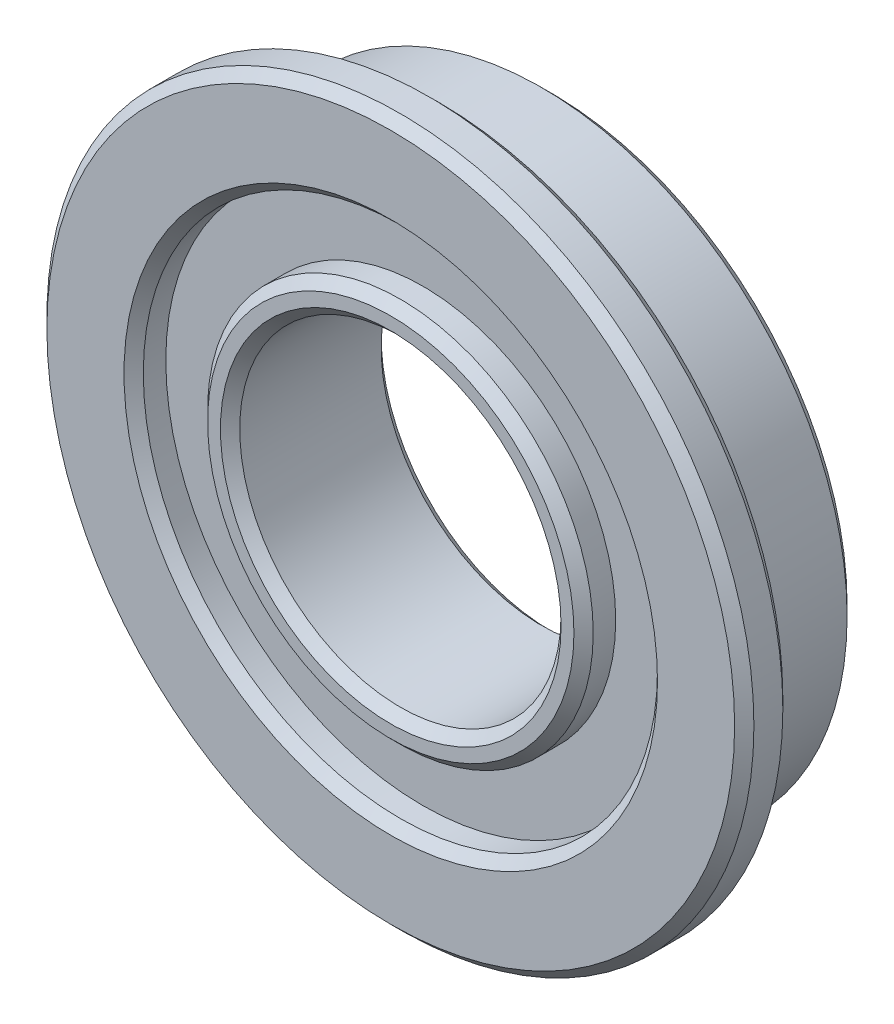
ISO-10303-21;
HEADER;
FILE_DESCRIPTION(('STEP AP214'),'2;1');
FILE_NAME('part.step','',(''),(''),'','','');
FILE_SCHEMA(('AUTOMOTIVE_DESIGN { 1 0 10303 214 1 1 1 1 }'));
ENDSEC;
DATA;
#1=APPLICATION_CONTEXT('core data for automotive mechanical design processes');
#2=APPLICATION_PROTOCOL_DEFINITION('international standard','automotive_design',2000,#1);
#3=PRODUCT_CONTEXT('',#1,'mechanical');
#4=PRODUCT('Part','Part','',(#3));
#5=PRODUCT_RELATED_PRODUCT_CATEGORY('part','',(#4));
#6=PRODUCT_DEFINITION_FORMATION('','',#4);
#7=PRODUCT_DEFINITION_CONTEXT('part definition',#1,'design');
#8=PRODUCT_DEFINITION('design','',#6,#7);
#9=PRODUCT_DEFINITION_SHAPE('','',#8);
#10=(LENGTH_UNIT() NAMED_UNIT(*) SI_UNIT(.MILLI.,.METRE.));
#11=(NAMED_UNIT(*) PLANE_ANGLE_UNIT() SI_UNIT($,.RADIAN.));
#12=(NAMED_UNIT(*) SI_UNIT($,.STERADIAN.) SOLID_ANGLE_UNIT());
#13=UNCERTAINTY_MEASURE_WITH_UNIT(LENGTH_MEASURE(1.E-05),#10,'distance_accuracy_value','');
#14=(GEOMETRIC_REPRESENTATION_CONTEXT(3) GLOBAL_UNCERTAINTY_ASSIGNED_CONTEXT((#13)) GLOBAL_UNIT_ASSIGNED_CONTEXT((#10,
#11,#12)) REPRESENTATION_CONTEXT('',''));
#15=CARTESIAN_POINT('',(0.,0.,0.));
#16=DIRECTION('',(0.,0.,1.));
#17=DIRECTION('',(1.,0.,0.));
#18=AXIS2_PLACEMENT_3D('',#15,#16,#17);
#19=CARTESIAN_POINT('',(0.,0.,5.));
#20=DIRECTION('',(0.,0.,1.));
#21=DIRECTION('',(1.,0.,0.));
#22=AXIS2_PLACEMENT_3D('',#19,#20,#21);
#23=PLANE('',#22);
#24=CARTESIAN_POINT('',(0.,0.,5.));
#25=DIRECTION('',(0.,0.,1.));
#26=DIRECTION('',(1.,0.,0.));
#27=AXIS2_PLACEMENT_3D('',#24,#25,#26);
#28=CIRCLE('',#27,5.7);
#29=CARTESIAN_POINT('',(5.7,0.,5.));
#30=VERTEX_POINT('',#29);
#31=EDGE_CURVE('E95',#30,#30,#28,.T.);
#32=ORIENTED_EDGE('',*,*,#31,.T.);
#33=EDGE_LOOP('',(#32));
#34=FACE_BOUND('',#33,.T.);
#35=CARTESIAN_POINT('',(0.,0.,5.));
#36=DIRECTION('',(0.,0.,1.));
#37=DIRECTION('',(1.,0.,0.));
#38=AXIS2_PLACEMENT_3D('',#35,#36,#37);
#39=CIRCLE('',#38,5.29999999999999);
#40=CARTESIAN_POINT('',(5.29999999999999,0.,5.));
#41=VERTEX_POINT('',#40);
#42=EDGE_CURVE('E98',#41,#41,#39,.F.);
#43=ORIENTED_EDGE('',*,*,#42,.T.);
#44=EDGE_LOOP('',(#43));
#45=FACE_BOUND('',#44,.T.);
#46=ADVANCED_FACE('F38',(#34,#45),#23,.T.);
#47=CARTESIAN_POINT('',(0.,0.,0.));
#48=DIRECTION('',(0.,0.,1.));
#49=DIRECTION('',(1.,0.,0.));
#50=AXIS2_PLACEMENT_3D('',#47,#48,#49);
#51=PLANE('',#50);
#52=CARTESIAN_POINT('',(0.,0.,0.));
#53=DIRECTION('',(0.,0.,1.));
#54=DIRECTION('',(1.,0.,0.));
#55=AXIS2_PLACEMENT_3D('',#52,#53,#54);
#56=CIRCLE('',#55,5.7);
#57=CARTESIAN_POINT('',(5.7,0.,0.));
#58=VERTEX_POINT('',#57);
#59=EDGE_CURVE('E46',#58,#58,#56,.F.);
#60=ORIENTED_EDGE('',*,*,#59,.T.);
#61=EDGE_LOOP('',(#60));
#62=FACE_BOUND('',#61,.T.);
#63=CARTESIAN_POINT('',(0.,0.,0.));
#64=DIRECTION('',(0.,0.,1.));
#65=DIRECTION('',(1.,0.,0.));
#66=AXIS2_PLACEMENT_3D('',#63,#64,#65);
#67=CIRCLE('',#66,5.3);
#68=CARTESIAN_POINT('',(5.3,0.,0.));
#69=VERTEX_POINT('',#68);
#70=EDGE_CURVE('E50',#69,#69,#67,.T.);
#71=ORIENTED_EDGE('',*,*,#70,.T.);
#72=EDGE_LOOP('',(#71));
#73=FACE_BOUND('',#72,.T.);
#74=ADVANCED_FACE('F136',(#62,#73),#51,.F.);
#75=CARTESIAN_POINT('',(0.,0.,5.));
#76=DIRECTION('',(0.,0.,-1.));
#77=DIRECTION('',(-1.,0.,0.));
#78=AXIS2_PLACEMENT_3D('',#75,#76,#77);
#79=CYLINDRICAL_SURFACE('',#78,9.5);
#80=CARTESIAN_POINT('',(0.,0.,0.299999999999998));
#81=DIRECTION('',(0.,0.,1.));
#82=DIRECTION('',(1.,0.,0.));
#83=AXIS2_PLACEMENT_3D('',#80,#81,#82);
#84=CIRCLE('',#83,9.5);
#85=CARTESIAN_POINT('',(9.5,0.,0.299999999999998));
#86=VERTEX_POINT('',#85);
#87=EDGE_CURVE('E65',#86,#86,#84,.T.);
#88=ORIENTED_EDGE('',*,*,#87,.T.);
#89=EDGE_LOOP('',(#88));
#90=FACE_BOUND('',#89,.T.);
#91=CARTESIAN_POINT('',(0.,0.,3.5));
#92=DIRECTION('',(0.,0.,1.));
#93=DIRECTION('',(1.,0.,0.));
#94=AXIS2_PLACEMENT_3D('',#91,#92,#93);
#95=CIRCLE('',#94,9.5);
#96=CARTESIAN_POINT('',(9.5,0.,3.5));
#97=VERTEX_POINT('',#96);
#98=EDGE_CURVE('E101',#97,#97,#95,.T.);
#99=ORIENTED_EDGE('',*,*,#98,.F.);
#100=EDGE_LOOP('',(#99));
#101=FACE_BOUND('',#100,.T.);
#102=ADVANCED_FACE('F143',(#90,#101),#79,.T.);
#103=CARTESIAN_POINT('',(0.,0.,5.));
#104=DIRECTION('',(0.,0.,1.));
#105=DIRECTION('',(1.,0.,0.));
#106=AXIS2_PLACEMENT_3D('',#103,#104,#105);
#107=CIRCLE('',#106,8.3);
#108=CARTESIAN_POINT('',(8.3,0.,5.));
#109=VERTEX_POINT('',#108);
#110=EDGE_CURVE('E77',#109,#109,#107,.F.);
#111=ORIENTED_EDGE('',*,*,#110,.T.);
#112=EDGE_LOOP('',(#111));
#113=FACE_BOUND('',#112,.T.);
#114=CARTESIAN_POINT('',(0.,0.,5.));
#115=DIRECTION('',(0.,0.,1.));
#116=DIRECTION('',(1.,0.,0.));
#117=AXIS2_PLACEMENT_3D('',#114,#115,#116);
#118=CIRCLE('',#117,10.7);
#119=CARTESIAN_POINT('',(10.7,0.,5.));
#120=VERTEX_POINT('',#119);
#121=EDGE_CURVE('E80',#120,#120,#118,.T.);
#122=ORIENTED_EDGE('',*,*,#121,.T.);
#123=EDGE_LOOP('',(#122));
#124=FACE_BOUND('',#123,.T.);
#125=ADVANCED_FACE('F139',(#113,#124),#23,.T.);
#126=CARTESIAN_POINT('',(0.,0.,0.));
#127=DIRECTION('',(0.,0.,1.));
#128=DIRECTION('',(1.,0.,0.));
#129=AXIS2_PLACEMENT_3D('',#126,#127,#128);
#130=CIRCLE('',#129,9.2);
#131=CARTESIAN_POINT('',(9.2,0.,0.));
#132=VERTEX_POINT('',#131);
#133=EDGE_CURVE('E59',#132,#132,#130,.F.);
#134=ORIENTED_EDGE('',*,*,#133,.T.);
#135=EDGE_LOOP('',(#134));
#136=FACE_BOUND('',#135,.T.);
#137=CARTESIAN_POINT('',(0.,0.,0.));
#138=DIRECTION('',(0.,0.,1.));
#139=DIRECTION('',(1.,0.,0.));
#140=AXIS2_PLACEMENT_3D('',#137,#138,#139);
#141=CIRCLE('',#140,8.30000000000001);
#142=CARTESIAN_POINT('',(-8.30000000000001,0.,0.));
#143=VERTEX_POINT('',#142);
#144=EDGE_CURVE('E62',#143,#143,#141,.T.);
#145=ORIENTED_EDGE('',*,*,#144,.T.);
#146=EDGE_LOOP('',(#145));
#147=FACE_BOUND('',#146,.T.);
#148=ADVANCED_FACE('F145',(#136,#147),#51,.F.);
#149=CARTESIAN_POINT('',(0.,0.,5.));
#150=DIRECTION('',(0.,0.,-1.));
#151=DIRECTION('',(-1.,0.,0.));
#152=AXIS2_PLACEMENT_3D('',#149,#150,#151);
#153=CYLINDRICAL_SURFACE('',#152,5.);
#154=CARTESIAN_POINT('',(0.,0.,4.70000000000001));
#155=DIRECTION('',(0.,0.,1.));
#156=DIRECTION('',(1.,0.,0.));
#157=AXIS2_PLACEMENT_3D('',#154,#155,#156);
#158=CIRCLE('',#157,5.);
#159=CARTESIAN_POINT('',(5.,0.,4.70000000000001));
#160=VERTEX_POINT('',#159);
#161=EDGE_CURVE('E86',#160,#160,#158,.T.);
#162=ORIENTED_EDGE('',*,*,#161,.T.);
#163=EDGE_LOOP('',(#162));
#164=FACE_BOUND('',#163,.T.);
#165=CARTESIAN_POINT('',(0.,0.,0.300000000000003));
#166=DIRECTION('',(0.,0.,1.));
#167=DIRECTION('',(1.,0.,0.));
#168=AXIS2_PLACEMENT_3D('',#165,#166,#167);
#169=CIRCLE('',#168,5.);
#170=CARTESIAN_POINT('',(5.,0.,0.300000000000003));
#171=VERTEX_POINT('',#170);
#172=EDGE_CURVE('E89',#171,#171,#169,.F.);
#173=ORIENTED_EDGE('',*,*,#172,.T.);
#174=EDGE_LOOP('',(#173));
#175=FACE_BOUND('',#174,.T.);
#176=ADVANCED_FACE('F154',(#164,#175),#153,.F.);
#177=CARTESIAN_POINT('',(0.,0.,3.5));
#178=DIRECTION('',(0.,0.,1.));
#179=DIRECTION('',(1.,0.,0.));
#180=AXIS2_PLACEMENT_3D('',#177,#178,#179);
#181=CYLINDRICAL_SURFACE('',#180,11.);
#182=CARTESIAN_POINT('',(0.,0.,4.7));
#183=DIRECTION('',(0.,0.,1.));
#184=DIRECTION('',(1.,0.,0.));
#185=AXIS2_PLACEMENT_3D('',#182,#183,#184);
#186=CIRCLE('',#185,11.);
#187=CARTESIAN_POINT('',(11.,0.,4.7));
#188=VERTEX_POINT('',#187);
#189=EDGE_CURVE('E71',#188,#188,#186,.F.);
#190=ORIENTED_EDGE('',*,*,#189,.T.);
#191=EDGE_LOOP('',(#190));
#192=FACE_BOUND('',#191,.T.);
#193=CARTESIAN_POINT('',(0.,0.,3.8));
#194=DIRECTION('',(0.,0.,1.));
#195=DIRECTION('',(1.,0.,0.));
#196=AXIS2_PLACEMENT_3D('',#193,#194,#195);
#197=CIRCLE('',#196,11.);
#198=CARTESIAN_POINT('',(11.,0.,3.8));
#199=VERTEX_POINT('',#198);
#200=EDGE_CURVE('E74',#199,#199,#197,.T.);
#201=ORIENTED_EDGE('',*,*,#200,.T.);
#202=EDGE_LOOP('',(#201));
#203=FACE_BOUND('',#202,.T.);
#204=ADVANCED_FACE('F219',(#192,#203),#181,.T.);
#205=CARTESIAN_POINT('',(0.,0.,3.5));
#206=DIRECTION('',(0.,0.,1.));
#207=DIRECTION('',(1.,0.,0.));
#208=AXIS2_PLACEMENT_3D('',#205,#206,#207);
#209=PLANE('',#208);
#210=CARTESIAN_POINT('',(0.,0.,3.5));
#211=DIRECTION('',(0.,0.,1.));
#212=DIRECTION('',(1.,0.,0.));
#213=AXIS2_PLACEMENT_3D('',#210,#211,#212);
#214=CIRCLE('',#213,10.7);
#215=CARTESIAN_POINT('',(10.7,0.,3.5));
#216=VERTEX_POINT('',#215);
#217=EDGE_CURVE('E68',#216,#216,#214,.F.);
#218=ORIENTED_EDGE('',*,*,#217,.T.);
#219=EDGE_LOOP('',(#218));
#220=FACE_BOUND('',#219,.T.);
#221=ORIENTED_EDGE('',*,*,#98,.T.);
#222=EDGE_LOOP('',(#221));
#223=FACE_BOUND('',#222,.T.);
#224=ADVANCED_FACE('F224',(#220,#223),#209,.F.);
#225=CARTESIAN_POINT('',(0.,0.,1.));
#226=DIRECTION('',(0.,0.,-1.));
#227=DIRECTION('',(-1.,0.,0.));
#228=AXIS2_PLACEMENT_3D('',#225,#226,#227);
#229=CYLINDRICAL_SURFACE('',#228,8.);
#230=CARTESIAN_POINT('',(0.,0.,0.300000000000005));
#231=DIRECTION('',(0.,0.,1.));
#232=DIRECTION('',(1.,0.,0.));
#233=AXIS2_PLACEMENT_3D('',#230,#231,#232);
#234=CIRCLE('',#233,8.);
#235=CARTESIAN_POINT('',(-8.,0.,0.300000000000005));
#236=VERTEX_POINT('',#235);
#237=EDGE_CURVE('E54',#236,#236,#234,.F.);
#238=ORIENTED_EDGE('',*,*,#237,.T.);
#239=EDGE_LOOP('',(#238));
#240=FACE_BOUND('',#239,.T.);
#241=CARTESIAN_POINT('',(0.,0.,1.));
#242=DIRECTION('',(0.,0.,-1.));
#243=DIRECTION('',(-1.,0.,0.));
#244=AXIS2_PLACEMENT_3D('',#241,#242,#243);
#245=CIRCLE('',#244,8.);
#246=CARTESIAN_POINT('',(-8.,0.,1.));
#247=VERTEX_POINT('',#246);
#248=EDGE_CURVE('E104',#247,#247,#245,.T.);
#249=ORIENTED_EDGE('',*,*,#248,.F.);
#250=EDGE_LOOP('',(#249));
#251=FACE_BOUND('',#250,.T.);
#252=ADVANCED_FACE('F230',(#240,#251),#229,.F.);
#253=CARTESIAN_POINT('',(0.,0.,1.));
#254=DIRECTION('',(0.,0.,-1.));
#255=DIRECTION('',(-1.,0.,0.));
#256=AXIS2_PLACEMENT_3D('',#253,#254,#255);
#257=PLANE('',#256);
#258=CARTESIAN_POINT('',(0.,0.,1.));
#259=DIRECTION('',(0.,0.,-1.));
#260=DIRECTION('',(-1.,0.,0.));
#261=AXIS2_PLACEMENT_3D('',#258,#259,#260);
#262=CIRCLE('',#261,6.);
#263=CARTESIAN_POINT('',(-6.,0.,1.));
#264=VERTEX_POINT('',#263);
#265=EDGE_CURVE('E107',#264,#264,#262,.T.);
#266=ORIENTED_EDGE('',*,*,#265,.F.);
#267=EDGE_LOOP('',(#266));
#268=FACE_BOUND('',#267,.T.);
#269=ORIENTED_EDGE('',*,*,#248,.T.);
#270=EDGE_LOOP('',(#269));
#271=FACE_BOUND('',#270,.T.);
#272=ADVANCED_FACE('F133',(#268,#271),#257,.T.);
#273=CARTESIAN_POINT('',(0.,0.,1.));
#274=DIRECTION('',(0.,0.,-1.));
#275=DIRECTION('',(-1.,0.,0.));
#276=AXIS2_PLACEMENT_3D('',#273,#274,#275);
#277=CYLINDRICAL_SURFACE('',#276,6.);
#278=CARTESIAN_POINT('',(0.,0.,0.299999999999997));
#279=DIRECTION('',(0.,0.,1.));
#280=DIRECTION('',(1.,0.,0.));
#281=AXIS2_PLACEMENT_3D('',#278,#279,#280);
#282=CIRCLE('',#281,6.);
#283=CARTESIAN_POINT('',(6.,0.,0.299999999999997));
#284=VERTEX_POINT('',#283);
#285=EDGE_CURVE('E10',#284,#284,#282,.T.);
#286=ORIENTED_EDGE('',*,*,#285,.T.);
#287=EDGE_LOOP('',(#286));
#288=FACE_BOUND('',#287,.T.);
#289=ORIENTED_EDGE('',*,*,#265,.T.);
#290=EDGE_LOOP('',(#289));
#291=FACE_BOUND('',#290,.T.);
#292=ADVANCED_FACE('F127',(#288,#291),#277,.T.);
#293=CARTESIAN_POINT('',(0.,0.,4.));
#294=DIRECTION('',(0.,0.,1.));
#295=DIRECTION('',(1.,0.,0.));
#296=AXIS2_PLACEMENT_3D('',#293,#294,#295);
#297=CYLINDRICAL_SURFACE('',#296,8.);
#298=CARTESIAN_POINT('',(0.,0.,4.70000000000001));
#299=DIRECTION('',(0.,0.,1.));
#300=DIRECTION('',(1.,0.,0.));
#301=AXIS2_PLACEMENT_3D('',#298,#299,#300);
#302=CIRCLE('',#301,8.);
#303=CARTESIAN_POINT('',(8.,0.,4.70000000000001));
#304=VERTEX_POINT('',#303);
#305=EDGE_CURVE('E83',#304,#304,#302,.T.);
#306=ORIENTED_EDGE('',*,*,#305,.T.);
#307=EDGE_LOOP('',(#306));
#308=FACE_BOUND('',#307,.T.);
#309=CARTESIAN_POINT('',(0.,0.,4.));
#310=DIRECTION('',(0.,0.,1.));
#311=DIRECTION('',(1.,0.,0.));
#312=AXIS2_PLACEMENT_3D('',#309,#310,#311);
#313=CIRCLE('',#312,8.);
#314=CARTESIAN_POINT('',(8.,0.,4.));
#315=VERTEX_POINT('',#314);
#316=EDGE_CURVE('E110',#315,#315,#313,.T.);
#317=ORIENTED_EDGE('',*,*,#316,.F.);
#318=EDGE_LOOP('',(#317));
#319=FACE_BOUND('',#318,.T.);
#320=ADVANCED_FACE('F122',(#308,#319),#297,.F.);
#321=CARTESIAN_POINT('',(0.,0.,4.));
#322=DIRECTION('',(0.,0.,1.));
#323=DIRECTION('',(1.,0.,0.));
#324=AXIS2_PLACEMENT_3D('',#321,#322,#323);
#325=PLANE('',#324);
#326=CARTESIAN_POINT('',(0.,0.,4.));
#327=DIRECTION('',(0.,0.,1.));
#328=DIRECTION('',(1.,0.,0.));
#329=AXIS2_PLACEMENT_3D('',#326,#327,#328);
#330=CIRCLE('',#329,6.);
#331=CARTESIAN_POINT('',(6.,0.,4.));
#332=VERTEX_POINT('',#331);
#333=EDGE_CURVE('E113',#332,#332,#330,.T.);
#334=ORIENTED_EDGE('',*,*,#333,.F.);
#335=EDGE_LOOP('',(#334));
#336=FACE_BOUND('',#335,.T.);
#337=ORIENTED_EDGE('',*,*,#316,.T.);
#338=EDGE_LOOP('',(#337));
#339=FACE_BOUND('',#338,.T.);
#340=ADVANCED_FACE('F119',(#336,#339),#325,.T.);
#341=CARTESIAN_POINT('',(0.,0.,4.));
#342=DIRECTION('',(0.,0.,1.));
#343=DIRECTION('',(1.,0.,0.));
#344=AXIS2_PLACEMENT_3D('',#341,#342,#343);
#345=CYLINDRICAL_SURFACE('',#344,6.);
#346=CARTESIAN_POINT('',(0.,0.,4.7));
#347=DIRECTION('',(0.,0.,1.));
#348=DIRECTION('',(1.,0.,0.));
#349=AXIS2_PLACEMENT_3D('',#346,#347,#348);
#350=CIRCLE('',#349,6.);
#351=CARTESIAN_POINT('',(6.,0.,4.7));
#352=VERTEX_POINT('',#351);
#353=EDGE_CURVE('E92',#352,#352,#350,.F.);
#354=ORIENTED_EDGE('',*,*,#353,.T.);
#355=EDGE_LOOP('',(#354));
#356=FACE_BOUND('',#355,.T.);
#357=ORIENTED_EDGE('',*,*,#333,.T.);
#358=EDGE_LOOP('',(#357));
#359=FACE_BOUND('',#358,.T.);
#360=ADVANCED_FACE('F117',(#356,#359),#345,.T.);
#361=CARTESIAN_POINT('',(0.,0.,5.));
#362=DIRECTION('',(0.,0.,-1.));
#363=DIRECTION('',(-1.,0.,0.));
#364=AXIS2_PLACEMENT_3D('',#361,#362,#363);
#365=CONICAL_SURFACE('',#364,5.7,0.785398163397448);
#366=ORIENTED_EDGE('',*,*,#353,.F.);
#367=EDGE_LOOP('',(#366));
#368=FACE_BOUND('',#367,.T.);
#369=ORIENTED_EDGE('',*,*,#31,.F.);
#370=EDGE_LOOP('',(#369));
#371=FACE_BOUND('',#370,.T.);
#372=ADVANCED_FACE('F272',(#368,#371),#365,.T.);
#373=CARTESIAN_POINT('',(0.,0.,4.70000000000001));
#374=DIRECTION('',(0.,0.,1.));
#375=DIRECTION('',(1.,0.,0.));
#376=AXIS2_PLACEMENT_3D('',#373,#374,#375);
#377=CONICAL_SURFACE('',#376,5.,0.785398163397448);
#378=ORIENTED_EDGE('',*,*,#42,.F.);
#379=EDGE_LOOP('',(#378));
#380=FACE_BOUND('',#379,.T.);
#381=ORIENTED_EDGE('',*,*,#161,.F.);
#382=EDGE_LOOP('',(#381));
#383=FACE_BOUND('',#382,.T.);
#384=ADVANCED_FACE('F175',(#380,#383),#377,.F.);
#385=CARTESIAN_POINT('',(0.,0.,4.70000000000001));
#386=DIRECTION('',(0.,0.,1.));
#387=DIRECTION('',(1.,0.,0.));
#388=AXIS2_PLACEMENT_3D('',#385,#386,#387);
#389=CONICAL_SURFACE('',#388,8.,0.785398163397448);
#390=ORIENTED_EDGE('',*,*,#110,.F.);
#391=EDGE_LOOP('',(#390));
#392=FACE_BOUND('',#391,.T.);
#393=ORIENTED_EDGE('',*,*,#305,.F.);
#394=EDGE_LOOP('',(#393));
#395=FACE_BOUND('',#394,.T.);
#396=ADVANCED_FACE('F165',(#392,#395),#389,.F.);
#397=CARTESIAN_POINT('',(0.,0.,5.));
#398=DIRECTION('',(0.,0.,-1.));
#399=DIRECTION('',(-1.,0.,0.));
#400=AXIS2_PLACEMENT_3D('',#397,#398,#399);
#401=CONICAL_SURFACE('',#400,10.7,0.785398163397443);
#402=ORIENTED_EDGE('',*,*,#189,.F.);
#403=EDGE_LOOP('',(#402));
#404=FACE_BOUND('',#403,.T.);
#405=ORIENTED_EDGE('',*,*,#121,.F.);
#406=EDGE_LOOP('',(#405));
#407=FACE_BOUND('',#406,.T.);
#408=ADVANCED_FACE('F162',(#404,#407),#401,.T.);
#409=CARTESIAN_POINT('',(0.,0.,3.8));
#410=DIRECTION('',(0.,0.,1.));
#411=DIRECTION('',(1.,0.,0.));
#412=AXIS2_PLACEMENT_3D('',#409,#410,#411);
#413=CONICAL_SURFACE('',#412,11.,0.785398163397451);
#414=ORIENTED_EDGE('',*,*,#217,.F.);
#415=EDGE_LOOP('',(#414));
#416=FACE_BOUND('',#415,.T.);
#417=ORIENTED_EDGE('',*,*,#200,.F.);
#418=EDGE_LOOP('',(#417));
#419=FACE_BOUND('',#418,.T.);
#420=ADVANCED_FACE('F164',(#416,#419),#413,.T.);
#421=CARTESIAN_POINT('',(0.,0.,0.299999999999998));
#422=DIRECTION('',(0.,0.,1.));
#423=DIRECTION('',(1.,0.,0.));
#424=AXIS2_PLACEMENT_3D('',#421,#422,#423);
#425=CONICAL_SURFACE('',#424,9.5,0.785398163397451);
#426=ORIENTED_EDGE('',*,*,#133,.F.);
#427=EDGE_LOOP('',(#426));
#428=FACE_BOUND('',#427,.T.);
#429=ORIENTED_EDGE('',*,*,#87,.F.);
#430=EDGE_LOOP('',(#429));
#431=FACE_BOUND('',#430,.T.);
#432=ADVANCED_FACE('F172',(#428,#431),#425,.T.);
#433=CARTESIAN_POINT('',(0.,0.,0.300000000000005));
#434=DIRECTION('',(0.,0.,-1.));
#435=DIRECTION('',(-1.,0.,0.));
#436=AXIS2_PLACEMENT_3D('',#433,#434,#435);
#437=CONICAL_SURFACE('',#436,8.,0.785398163397448);
#438=CARTESIAN_POINT('',(-8.30000000000001,0.,0.));
#439=CARTESIAN_POINT('',(-8.296875,0.,0.00312499999999959));
#440=CARTESIAN_POINT('',(-8.29375,0.,0.00624999999999978));
#441=CARTESIAN_POINT('',(-8.2875,0.,0.0125000000000001));
#442=CARTESIAN_POINT('',(-8.28437500000001,0.,0.0156250000000003));
#443=CARTESIAN_POINT('',(-8.27812500000001,0.,0.0218750000000005));
#444=CARTESIAN_POINT('',(-8.275,0.,0.0250000000000005));
#445=CARTESIAN_POINT('',(-8.26875000000001,0.,0.0312500000000004));
#446=CARTESIAN_POINT('',(-8.265625,0.,0.0343750000000003));
#447=CARTESIAN_POINT('',(-8.259375,0.,0.0406250000000005));
#448=CARTESIAN_POINT('',(-8.25625,0.,0.0437500000000008));
#449=CARTESIAN_POINT('',(-8.25000000000001,0.,0.050000000000001));
#450=CARTESIAN_POINT('',(-8.246875,0.,0.0531250000000009));
#451=CARTESIAN_POINT('',(-8.240625,0.,0.0593750000000008));
#452=CARTESIAN_POINT('',(-8.2375,0.,0.0625000000000008));
#453=CARTESIAN_POINT('',(-8.23125,0.,0.068750000000001));
#454=CARTESIAN_POINT('',(-8.228125,0.,0.0718750000000013));
#455=CARTESIAN_POINT('',(-8.22187500000001,0.,0.0781250000000014));
#456=CARTESIAN_POINT('',(-8.21875,0.,0.0812500000000013));
#457=CARTESIAN_POINT('',(-8.2125,0.,0.0875000000000014));
#458=CARTESIAN_POINT('',(-8.209375,0.,0.0906250000000015));
#459=CARTESIAN_POINT('',(-8.203125,0.,0.0968750000000015));
#460=CARTESIAN_POINT('',(-8.2,0.,0.100000000000001));
#461=CARTESIAN_POINT('',(-8.19375,0.,0.106250000000002));
#462=CARTESIAN_POINT('',(-8.190625,0.,0.109375000000002));
#463=CARTESIAN_POINT('',(-8.184375,0.,0.115625000000002));
#464=CARTESIAN_POINT('',(-8.18125,0.,0.118750000000002));
#465=CARTESIAN_POINT('',(-8.175,0.,0.125000000000002));
#466=CARTESIAN_POINT('',(-8.171875,0.,0.128125000000002));
#467=CARTESIAN_POINT('',(-8.165625,0.,0.134375000000002));
#468=CARTESIAN_POINT('',(-8.1625,0.,0.137500000000002));
#469=CARTESIAN_POINT('',(-8.15625,0.,0.143750000000003));
#470=CARTESIAN_POINT('',(-8.153125,0.,0.146875000000003));
#471=CARTESIAN_POINT('',(-8.146875,0.,0.153125000000002));
#472=CARTESIAN_POINT('',(-8.14375,0.,0.156250000000002));
#473=CARTESIAN_POINT('',(-8.1375,0.,0.162500000000003));
#474=CARTESIAN_POINT('',(-8.134375,0.,0.165625000000003));
#475=CARTESIAN_POINT('',(-8.128125,0.,0.171875000000003));
#476=CARTESIAN_POINT('',(-8.125,0.,0.175000000000003));
#477=CARTESIAN_POINT('',(-8.11875,0.,0.181250000000003));
#478=CARTESIAN_POINT('',(-8.115625,0.,0.184375000000003));
#479=CARTESIAN_POINT('',(-8.109375,0.,0.190625000000003));
#480=CARTESIAN_POINT('',(-8.10625,0.,0.193750000000003));
#481=CARTESIAN_POINT('',(-8.1,0.,0.200000000000004));
#482=CARTESIAN_POINT('',(-8.096875,0.,0.203125000000004));
#483=CARTESIAN_POINT('',(-8.090625,0.,0.209375000000003));
#484=CARTESIAN_POINT('',(-8.0875,0.,0.212500000000003));
#485=CARTESIAN_POINT('',(-8.08125,0.,0.218750000000004));
#486=CARTESIAN_POINT('',(-8.078125,0.,0.221875000000004));
#487=CARTESIAN_POINT('',(-8.071875,0.,0.228125000000004));
#488=CARTESIAN_POINT('',(-8.06875,0.,0.231250000000004));
#489=CARTESIAN_POINT('',(-8.0625,0.,0.237500000000004));
#490=CARTESIAN_POINT('',(-8.059375,0.,0.240625000000004));
#491=CARTESIAN_POINT('',(-8.053125,0.,0.246875000000004));
#492=CARTESIAN_POINT('',(-8.05,0.,0.250000000000004));
#493=CARTESIAN_POINT('',(-8.04375,0.,0.256250000000004));
#494=CARTESIAN_POINT('',(-8.040625,0.,0.259375000000004));
#495=CARTESIAN_POINT('',(-8.034375,0.,0.265625000000005));
#496=CARTESIAN_POINT('',(-8.03125,0.,0.268750000000005));
#497=CARTESIAN_POINT('',(-8.025,0.,0.275000000000005));
#498=CARTESIAN_POINT('',(-8.021875,0.,0.278125000000005));
#499=CARTESIAN_POINT('',(-8.015625,0.,0.284375000000005));
#500=CARTESIAN_POINT('',(-8.0125,0.,0.287500000000005));
#501=CARTESIAN_POINT('',(-8.00625,0.,0.293750000000005));
#502=CARTESIAN_POINT('',(-8.003125,0.,0.296875000000005));
#503=CARTESIAN_POINT('',(-8.,0.,0.300000000000005));
#504=B_SPLINE_CURVE_WITH_KNOTS('',3,(#438,#439,#440,#441,#442,#443,#444,#445,#446,#447,#448,
#449,#450,#451,#452,#453,#454,#455,#456,#457,#458,#459,#460,#461,#462,#463,#464,#465,#466,#467,
#468,#469,#470,#471,#472,#473,#474,#475,#476,#477,#478,#479,#480,#481,#482,#483,#484,#485,#486,
#487,#488,#489,#490,#491,#492,#493,#494,#495,#496,#497,#498,#499,#500,#501,#502,#503),
.UNSPECIFIED.,.F.,.F.,(4,2,2,2,2,2,2,2,2,2,2,2,2,2,2,2,2,2,2,2,2,2,2,2,2,2,2,2,2,2,2,2,4),(0.,
0.0132582521472484,0.0265165042944955,0.0397747564417439,0.0530330085889923,0.0662912607362394,
0.0795495128834878,0.0928077650307362,0.106066017177983,0.119324269325232,0.13258252147248,
0.145840773619728,0.159099025766976,0.172357277914224,0.185615530061472,0.19887378220872,
0.212132034355968,0.225390286503216,0.238648538650463,0.251906790797712,0.26516504294496,
0.278423295092207,0.291681547239456,0.304939799386704,0.318198051533951,0.3314563036812,
0.344714555828448,0.357972807975696,0.371231060122943,0.384489312270192,0.39774756441744,
0.411005816564687,0.424264068711936),.UNSPECIFIED.);
#505=EDGE_CURVE('BSEAM194',#143,#236,#504,.T.);
#506=ORIENTED_EDGE('',*,*,#144,.F.);
#507=ORIENTED_EDGE('',*,*,#237,.F.);
#508=ORIENTED_EDGE('',*,*,#505,.T.);
#509=ORIENTED_EDGE('',*,*,#505,.F.);
#510=EDGE_LOOP('',(#506,#508,#507,#509));
#511=FACE_BOUND('',#510,.T.);
#512=ADVANCED_FACE('F194',(#511),#437,.F.);
#513=CARTESIAN_POINT('',(0.,0.,0.));
#514=DIRECTION('',(0.,0.,1.));
#515=DIRECTION('',(1.,0.,0.));
#516=AXIS2_PLACEMENT_3D('',#513,#514,#515);
#517=CONICAL_SURFACE('',#516,5.7,0.785398163397448);
#518=ORIENTED_EDGE('',*,*,#285,.F.);
#519=EDGE_LOOP('',(#518));
#520=FACE_BOUND('',#519,.T.);
#521=ORIENTED_EDGE('',*,*,#59,.F.);
#522=EDGE_LOOP('',(#521));
#523=FACE_BOUND('',#522,.T.);
#524=ADVANCED_FACE('F200',(#520,#523),#517,.T.);
#525=CARTESIAN_POINT('',(0.,0.,0.));
#526=DIRECTION('',(0.,0.,-1.));
#527=DIRECTION('',(-1.,0.,0.));
#528=AXIS2_PLACEMENT_3D('',#525,#526,#527);
#529=CONICAL_SURFACE('',#528,5.3,0.785398163397448);
#530=ORIENTED_EDGE('',*,*,#172,.F.);
#531=EDGE_LOOP('',(#530));
#532=FACE_BOUND('',#531,.T.);
#533=ORIENTED_EDGE('',*,*,#70,.F.);
#534=EDGE_LOOP('',(#533));
#535=FACE_BOUND('',#534,.T.);
#536=ADVANCED_FACE('F41',(#532,#535),#529,.F.);
#537=CLOSED_SHELL('',(#46,#74,#102,#125,#148,#176,#204,#224,#252,#272,#292,#320,#340,#360,#372,
#384,#396,#408,#420,#432,#512,#524,#536));
#538=MANIFOLD_SOLID_BREP('B2',#537);
#539=ADVANCED_BREP_SHAPE_REPRESENTATION('',(#18,#538),#14);
#540=SHAPE_DEFINITION_REPRESENTATION(#9,#539);
ENDSEC;
END-ISO-10303-21;
